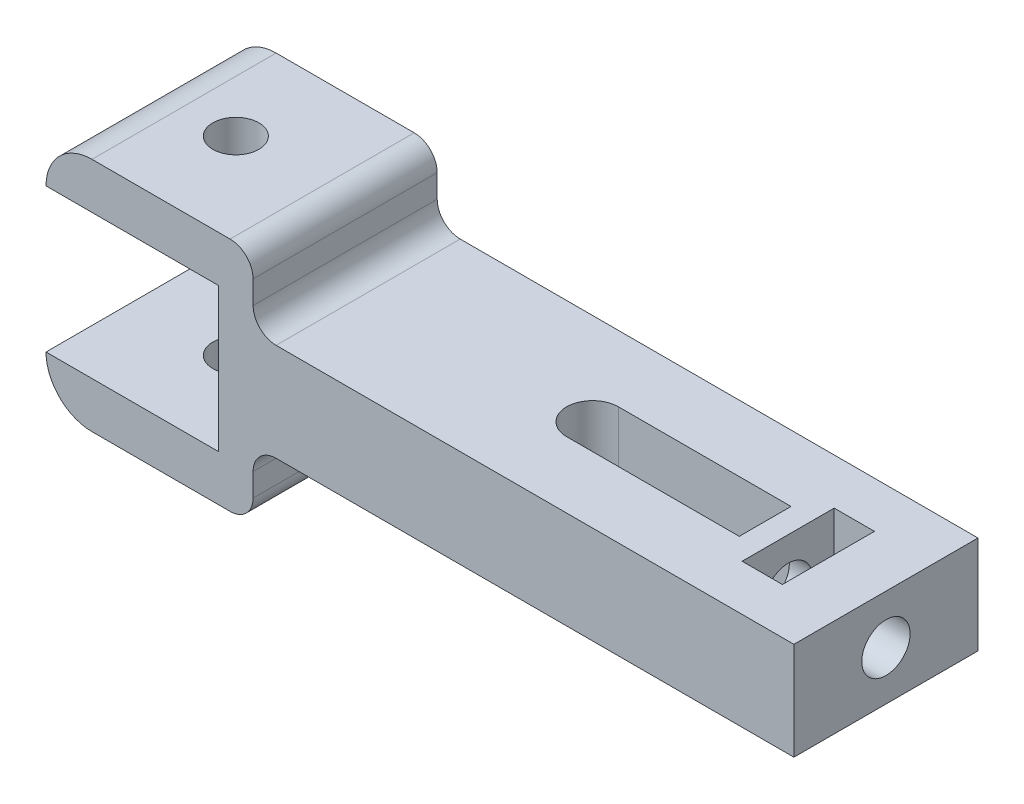
ISO-10303-21;
HEADER;
FILE_DESCRIPTION(('STEP AP214'),'2;1');
FILE_NAME('part.step','',(''),(''),'','','');
FILE_SCHEMA(('AUTOMOTIVE_DESIGN { 1 0 10303 214 1 1 1 1 }'));
ENDSEC;
DATA;
#1=APPLICATION_CONTEXT('core data for automotive mechanical design processes');
#2=APPLICATION_PROTOCOL_DEFINITION('international standard','automotive_design',2000,#1);
#3=PRODUCT_CONTEXT('',#1,'mechanical');
#4=PRODUCT('Part','Part','',(#3));
#5=PRODUCT_RELATED_PRODUCT_CATEGORY('part','',(#4));
#6=PRODUCT_DEFINITION_FORMATION('','',#4);
#7=PRODUCT_DEFINITION_CONTEXT('part definition',#1,'design');
#8=PRODUCT_DEFINITION('design','',#6,#7);
#9=PRODUCT_DEFINITION_SHAPE('','',#8);
#10=(LENGTH_UNIT() NAMED_UNIT(*) SI_UNIT(.MILLI.,.METRE.));
#11=(NAMED_UNIT(*) PLANE_ANGLE_UNIT() SI_UNIT($,.RADIAN.));
#12=(NAMED_UNIT(*) SI_UNIT($,.STERADIAN.) SOLID_ANGLE_UNIT());
#13=UNCERTAINTY_MEASURE_WITH_UNIT(LENGTH_MEASURE(1.E-05),#10,'distance_accuracy_value','');
#14=(GEOMETRIC_REPRESENTATION_CONTEXT(3) GLOBAL_UNCERTAINTY_ASSIGNED_CONTEXT((#13)) GLOBAL_UNIT_ASSIGNED_CONTEXT((#10,
#11,#12)) REPRESENTATION_CONTEXT('',''));
#15=CARTESIAN_POINT('',(0.,0.,0.));
#16=DIRECTION('',(0.,0.,1.));
#17=DIRECTION('',(1.,0.,0.));
#18=AXIS2_PLACEMENT_3D('',#15,#16,#17);
#19=CARTESIAN_POINT('',(-50.,1.99999999999999,16.));
#20=DIRECTION('',(1.,0.,0.));
#21=DIRECTION('',(0.,0.,-1.));
#22=AXIS2_PLACEMENT_3D('',#19,#20,#21);
#23=PLANE('',#22);
#24=DIRECTION('',(0.,-1.,0.));
#25=VECTOR('',#24,1.);
#26=CARTESIAN_POINT('',(-50.,27.4558441227157,13.6568542494924));
#27=LINE('',#26,#25);
#28=CARTESIAN_POINT('',(-50.,-10.5,13.6568542494924));
#29=VERTEX_POINT('',#28);
#30=CARTESIAN_POINT('',(-50.,1.99999999999999,13.6568542494924));
#31=VERTEX_POINT('',#30);
#32=EDGE_CURVE('E211',#29,#31,#27,.F.);
#33=ORIENTED_EDGE('',*,*,#32,.F.);
#34=DIRECTION('',(0.,0.,-1.));
#35=VECTOR('',#34,1.);
#36=CARTESIAN_POINT('',(-50.,-10.5,16.));
#37=LINE('',#36,#35);
#38=CARTESIAN_POINT('',(-50.,-10.5,16.));
#39=VERTEX_POINT('',#38);
#40=EDGE_CURVE('E231',#39,#29,#37,.T.);
#41=ORIENTED_EDGE('',*,*,#40,.F.);
#42=DIRECTION('',(0.,-1.,0.));
#43=VECTOR('',#42,1.);
#44=CARTESIAN_POINT('',(-50.,1.99999999999999,16.));
#45=LINE('',#44,#43);
#46=CARTESIAN_POINT('',(-50.,1.99999999999999,16.));
#47=VERTEX_POINT('',#46);
#48=EDGE_CURVE('E383',#47,#39,#45,.T.);
#49=ORIENTED_EDGE('',*,*,#48,.F.);
#50=DIRECTION('',(0.,0.,-1.));
#51=VECTOR('',#50,1.);
#52=CARTESIAN_POINT('',(-50.,1.99999999999999,16.));
#53=LINE('',#52,#51);
#54=EDGE_CURVE('E230',#47,#31,#53,.T.);
#55=ORIENTED_EDGE('',*,*,#54,.T.);
#56=EDGE_LOOP('',(#33,#41,#49,#55));
#57=FACE_BOUND('',#56,.T.);
#58=ADVANCED_FACE('F33',(#57),#23,.F.);
#59=DIRECTION('',(0.,-1.,0.));
#60=VECTOR('',#59,1.);
#61=CARTESIAN_POINT('',(-50.,27.4558441227157,2.34314575050762));
#62=LINE('',#61,#60);
#63=CARTESIAN_POINT('',(-50.,1.99999999999999,2.34314575050762));
#64=VERTEX_POINT('',#63);
#65=CARTESIAN_POINT('',(-50.,-10.5,2.34314575050762));
#66=VERTEX_POINT('',#65);
#67=EDGE_CURVE('E208',#64,#66,#62,.T.);
#68=ORIENTED_EDGE('',*,*,#67,.F.);
#69=CARTESIAN_POINT('',(-50.,1.99999999999999,0.));
#70=VERTEX_POINT('',#69);
#71=EDGE_CURVE('E223',#64,#70,#53,.T.);
#72=ORIENTED_EDGE('',*,*,#71,.T.);
#73=DIRECTION('',(0.,-1.,0.));
#74=VECTOR('',#73,1.);
#75=CARTESIAN_POINT('',(-50.,1.99999999999999,0.));
#76=LINE('',#75,#74);
#77=CARTESIAN_POINT('',(-50.,-10.5,0.));
#78=VERTEX_POINT('',#77);
#79=EDGE_CURVE('E338',#70,#78,#76,.T.);
#80=ORIENTED_EDGE('',*,*,#79,.T.);
#81=EDGE_CURVE('E225',#66,#78,#37,.T.);
#82=ORIENTED_EDGE('',*,*,#81,.F.);
#83=EDGE_LOOP('',(#68,#72,#80,#82));
#84=FACE_BOUND('',#83,.T.);
#85=ADVANCED_FACE('F221',(#84),#23,.F.);
#86=CARTESIAN_POINT('',(0.,0.,16.));
#87=DIRECTION('',(-1.,0.,0.));
#88=DIRECTION('',(0.,-1.,0.));
#89=AXIS2_PLACEMENT_3D('',#86,#87,#88);
#90=PLANE('',#89);
#91=CARTESIAN_POINT('',(0.,-4.25,8.));
#92=DIRECTION('',(1.,0.,0.));
#93=DIRECTION('',(0.,1.,0.));
#94=AXIS2_PLACEMENT_3D('',#91,#92,#93);
#95=CIRCLE('',#94,2.1);
#96=CARTESIAN_POINT('',(0.,-2.15,8.));
#97=VERTEX_POINT('',#96);
#98=EDGE_CURVE('E444',#97,#97,#95,.T.);
#99=ORIENTED_EDGE('',*,*,#98,.F.);
#100=EDGE_LOOP('',(#99));
#101=FACE_BOUND('',#100,.T.);
#102=DIRECTION('',(0.,1.,0.));
#103=VECTOR('',#102,1.);
#104=CARTESIAN_POINT('',(0.,0.,0.));
#105=LINE('',#104,#103);
#106=CARTESIAN_POINT('',(0.,-8.5,0.));
#107=VERTEX_POINT('',#106);
#108=CARTESIAN_POINT('',(0.,0.,0.));
#109=VERTEX_POINT('',#108);
#110=EDGE_CURVE('E364',#107,#109,#105,.T.);
#111=ORIENTED_EDGE('',*,*,#110,.T.);
#112=DIRECTION('',(0.,0.,-1.));
#113=VECTOR('',#112,1.);
#114=CARTESIAN_POINT('',(0.,0.,16.));
#115=LINE('',#114,#113);
#116=CARTESIAN_POINT('',(0.,0.,16.));
#117=VERTEX_POINT('',#116);
#118=EDGE_CURVE('E239',#117,#109,#115,.T.);
#119=ORIENTED_EDGE('',*,*,#118,.F.);
#120=DIRECTION('',(0.,1.,0.));
#121=VECTOR('',#120,1.);
#122=CARTESIAN_POINT('',(0.,0.,16.));
#123=LINE('',#122,#121);
#124=CARTESIAN_POINT('',(0.,-8.5,16.));
#125=VERTEX_POINT('',#124);
#126=EDGE_CURVE('E349',#125,#117,#123,.T.);
#127=ORIENTED_EDGE('',*,*,#126,.F.);
#128=DIRECTION('',(0.,0.,-1.));
#129=VECTOR('',#128,1.);
#130=CARTESIAN_POINT('',(0.,-8.5,16.));
#131=LINE('',#130,#129);
#132=EDGE_CURVE('E350',#125,#107,#131,.T.);
#133=ORIENTED_EDGE('',*,*,#132,.T.);
#134=EDGE_LOOP('',(#111,#119,#127,#133));
#135=FACE_BOUND('',#134,.T.);
#136=ADVANCED_FACE('F486',(#101,#135),#90,.F.);
#137=CARTESIAN_POINT('',(0.,0.,16.));
#138=DIRECTION('',(0.,-1.,0.));
#139=DIRECTION('',(1.,0.,0.));
#140=AXIS2_PLACEMENT_3D('',#137,#138,#139);
#141=PLANE('',#140);
#142=DIRECTION('',(-1.,0.,0.));
#143=VECTOR('',#142,1.);
#144=CARTESIAN_POINT('',(-25.5,0.,5.75));
#145=LINE('',#144,#143);
#146=CARTESIAN_POINT('',(-10.5,0.,5.75));
#147=VERTEX_POINT('',#146);
#148=CARTESIAN_POINT('',(-25.5,0.,5.75));
#149=VERTEX_POINT('',#148);
#150=EDGE_CURVE('E430',#147,#149,#145,.T.);
#151=ORIENTED_EDGE('',*,*,#150,.F.);
#152=DIRECTION('',(0.,0.,-1.));
#153=VECTOR('',#152,1.);
#154=CARTESIAN_POINT('',(-10.5,0.,10.25));
#155=LINE('',#154,#153);
#156=CARTESIAN_POINT('',(-10.5,0.,10.25));
#157=VERTEX_POINT('',#156);
#158=EDGE_CURVE('E433',#157,#147,#155,.T.);
#159=ORIENTED_EDGE('',*,*,#158,.F.);
#160=DIRECTION('',(1.,0.,0.));
#161=VECTOR('',#160,1.);
#162=CARTESIAN_POINT('',(-25.5,0.,10.25));
#163=LINE('',#162,#161);
#164=CARTESIAN_POINT('',(-25.5,0.,10.25));
#165=VERTEX_POINT('',#164);
#166=EDGE_CURVE('E420',#165,#157,#163,.T.);
#167=ORIENTED_EDGE('',*,*,#166,.F.);
#168=CARTESIAN_POINT('',(-25.5000004026552,0.,8.));
#169=DIRECTION('',(0.,1.,0.));
#170=DIRECTION('',(-1.,0.,0.));
#171=AXIS2_PLACEMENT_3D('',#168,#169,#170);
#172=CIRCLE('',#171,2.25000000000004);
#173=EDGE_CURVE('E427',#149,#165,#172,.T.);
#174=ORIENTED_EDGE('',*,*,#173,.F.);
#175=EDGE_LOOP('',(#151,#159,#167,#174));
#176=FACE_BOUND('',#175,.T.);
#177=DIRECTION('',(-1.,0.,0.));
#178=VECTOR('',#177,1.);
#179=CARTESIAN_POINT('',(-8.5,0.,4.));
#180=LINE('',#179,#178);
#181=CARTESIAN_POINT('',(-5.,0.,4.));
#182=VERTEX_POINT('',#181);
#183=CARTESIAN_POINT('',(-8.5,0.,4.));
#184=VERTEX_POINT('',#183);
#185=EDGE_CURVE('E410',#182,#184,#180,.T.);
#186=ORIENTED_EDGE('',*,*,#185,.F.);
#187=DIRECTION('',(0.,0.,-1.));
#188=VECTOR('',#187,1.);
#189=CARTESIAN_POINT('',(-5.,0.,4.));
#190=LINE('',#189,#188);
#191=CARTESIAN_POINT('',(-5.,0.,12.));
#192=VERTEX_POINT('',#191);
#193=EDGE_CURVE('E413',#192,#182,#190,.T.);
#194=ORIENTED_EDGE('',*,*,#193,.F.);
#195=DIRECTION('',(1.,0.,0.));
#196=VECTOR('',#195,1.);
#197=CARTESIAN_POINT('',(-8.5,0.,12.));
#198=LINE('',#197,#196);
#199=CARTESIAN_POINT('',(-8.5,0.,12.));
#200=VERTEX_POINT('',#199);
#201=EDGE_CURVE('E400',#200,#192,#198,.T.);
#202=ORIENTED_EDGE('',*,*,#201,.F.);
#203=DIRECTION('',(0.,0.,1.));
#204=VECTOR('',#203,1.);
#205=CARTESIAN_POINT('',(-8.5,0.,4.));
#206=LINE('',#205,#204);
#207=EDGE_CURVE('E407',#184,#200,#206,.T.);
#208=ORIENTED_EDGE('',*,*,#207,.F.);
#209=EDGE_LOOP('',(#186,#194,#202,#208));
#210=FACE_BOUND('',#209,.T.);
#211=DIRECTION('',(-1.,0.,0.));
#212=VECTOR('',#211,1.);
#213=CARTESIAN_POINT('',(0.,0.,0.));
#214=LINE('',#213,#212);
#215=CARTESIAN_POINT('',(-45.,0.,0.));
#216=VERTEX_POINT('',#215);
#217=EDGE_CURVE('E366',#109,#216,#214,.T.);
#218=ORIENTED_EDGE('',*,*,#217,.T.);
#219=DIRECTION('',(0.,0.,-1.));
#220=VECTOR('',#219,1.);
#221=CARTESIAN_POINT('',(-45.,0.,16.));
#222=LINE('',#221,#220);
#223=CARTESIAN_POINT('',(-45.,0.,16.));
#224=VERTEX_POINT('',#223);
#225=EDGE_CURVE('E291',#216,#224,#222,.F.);
#226=ORIENTED_EDGE('',*,*,#225,.T.);
#227=DIRECTION('',(-1.,0.,0.));
#228=VECTOR('',#227,1.);
#229=CARTESIAN_POINT('',(0.,0.,16.));
#230=LINE('',#229,#228);
#231=EDGE_CURVE('E392',#117,#224,#230,.T.);
#232=ORIENTED_EDGE('',*,*,#231,.F.);
#233=ORIENTED_EDGE('',*,*,#118,.T.);
#234=EDGE_LOOP('',(#218,#226,#232,#233));
#235=FACE_BOUND('',#234,.T.);
#236=ADVANCED_FACE('F494',(#176,#210,#235),#141,.F.);
#237=CARTESIAN_POINT('',(-47.,0.,16.));
#238=DIRECTION('',(-1.,0.,0.));
#239=DIRECTION('',(0.,0.,1.));
#240=AXIS2_PLACEMENT_3D('',#237,#238,#239);
#241=PLANE('',#240);
#242=DIRECTION('',(0.,1.,0.));
#243=VECTOR('',#242,1.);
#244=CARTESIAN_POINT('',(-47.,0.,0.));
#245=LINE('',#244,#243);
#246=CARTESIAN_POINT('',(-47.,1.99999999999999,0.));
#247=VERTEX_POINT('',#246);
#248=CARTESIAN_POINT('',(-47.,3.99999999999999,0.));
#249=VERTEX_POINT('',#248);
#250=EDGE_CURVE('E370',#247,#249,#245,.T.);
#251=ORIENTED_EDGE('',*,*,#250,.T.);
#252=DIRECTION('',(0.,0.,-1.));
#253=VECTOR('',#252,1.);
#254=CARTESIAN_POINT('',(-47.,3.99999999999999,16.));
#255=LINE('',#254,#253);
#256=CARTESIAN_POINT('',(-47.,3.99999999999999,16.));
#257=VERTEX_POINT('',#256);
#258=EDGE_CURVE('E285',#249,#257,#255,.F.);
#259=ORIENTED_EDGE('',*,*,#258,.T.);
#260=DIRECTION('',(0.,1.,0.));
#261=VECTOR('',#260,1.);
#262=CARTESIAN_POINT('',(-47.,0.,16.));
#263=LINE('',#262,#261);
#264=CARTESIAN_POINT('',(-47.,1.99999999999999,16.));
#265=VERTEX_POINT('',#264);
#266=EDGE_CURVE('E386',#265,#257,#263,.T.);
#267=ORIENTED_EDGE('',*,*,#266,.F.);
#268=DIRECTION('',(0.,0.,-1.));
#269=VECTOR('',#268,1.);
#270=CARTESIAN_POINT('',(-47.,1.99999999999999,0.));
#271=LINE('',#270,#269);
#272=EDGE_CURVE('E282',#265,#247,#271,.T.);
#273=ORIENTED_EDGE('',*,*,#272,.T.);
#274=EDGE_LOOP('',(#251,#259,#267,#273));
#275=FACE_BOUND('',#274,.T.);
#276=ADVANCED_FACE('F490',(#275),#241,.F.);
#277=CARTESIAN_POINT('',(-47.,5.99999999999999,16.));
#278=DIRECTION('',(0.,-1.,0.));
#279=DIRECTION('',(1.,0.,0.));
#280=AXIS2_PLACEMENT_3D('',#277,#278,#279);
#281=PLANE('',#280);
#282=CARTESIAN_POINT('',(-56.5,5.99999999999999,8.));
#283=DIRECTION('',(0.,1.,0.));
#284=DIRECTION('',(-1.,0.,0.));
#285=AXIS2_PLACEMENT_3D('',#282,#283,#284);
#286=CIRCLE('',#285,2.);
#287=CARTESIAN_POINT('',(-58.5,5.99999999999999,8.));
#288=VERTEX_POINT('',#287);
#289=EDGE_CURVE('E456',#288,#288,#286,.T.);
#290=ORIENTED_EDGE('',*,*,#289,.F.);
#291=EDGE_LOOP('',(#290));
#292=FACE_BOUND('',#291,.T.);
#293=DIRECTION('',(-1.,0.,0.));
#294=VECTOR('',#293,1.);
#295=CARTESIAN_POINT('',(-47.,5.99999999999999,0.));
#296=LINE('',#295,#294);
#297=CARTESIAN_POINT('',(-49.,5.99999999999999,0.));
#298=VERTEX_POINT('',#297);
#299=CARTESIAN_POINT('',(-61.,5.99999999999999,0.));
#300=VERTEX_POINT('',#299);
#301=EDGE_CURVE('E373',#298,#300,#296,.T.);
#302=ORIENTED_EDGE('',*,*,#301,.T.);
#303=DIRECTION('',(0.,0.,-1.));
#304=VECTOR('',#303,1.);
#305=CARTESIAN_POINT('',(-61.,5.99999999999999,16.));
#306=LINE('',#305,#304);
#307=CARTESIAN_POINT('',(-61.,5.99999999999999,16.));
#308=VERTEX_POINT('',#307);
#309=EDGE_CURVE('E11',#300,#308,#306,.F.);
#310=ORIENTED_EDGE('',*,*,#309,.T.);
#311=DIRECTION('',(-1.,0.,0.));
#312=VECTOR('',#311,1.);
#313=CARTESIAN_POINT('',(-47.,5.99999999999999,16.));
#314=LINE('',#313,#312);
#315=CARTESIAN_POINT('',(-49.,5.99999999999999,16.));
#316=VERTEX_POINT('',#315);
#317=EDGE_CURVE('E381',#316,#308,#314,.T.);
#318=ORIENTED_EDGE('',*,*,#317,.F.);
#319=DIRECTION('',(0.,0.,-1.));
#320=VECTOR('',#319,1.);
#321=CARTESIAN_POINT('',(-49.,5.99999999999999,16.));
#322=LINE('',#321,#320);
#323=EDGE_CURVE('E274',#316,#298,#322,.T.);
#324=ORIENTED_EDGE('',*,*,#323,.T.);
#325=EDGE_LOOP('',(#302,#310,#318,#324));
#326=FACE_BOUND('',#325,.T.);
#327=ADVANCED_FACE('F374',(#292,#326),#281,.F.);
#328=CARTESIAN_POINT('',(-65.,1.99999999999999,16.));
#329=DIRECTION('',(0.,1.,0.));
#330=DIRECTION('',(-1.,0.,0.));
#331=AXIS2_PLACEMENT_3D('',#328,#329,#330);
#332=PLANE('',#331);
#333=CARTESIAN_POINT('',(-56.5,1.99999999999999,8.));
#334=DIRECTION('',(0.,1.,0.));
#335=DIRECTION('',(-1.,0.,0.));
#336=AXIS2_PLACEMENT_3D('',#333,#334,#335);
#337=CIRCLE('',#336,2.);
#338=CARTESIAN_POINT('',(-58.5,1.99999999999999,8.));
#339=VERTEX_POINT('',#338);
#340=EDGE_CURVE('E449',#339,#339,#337,.T.);
#341=ORIENTED_EDGE('',*,*,#340,.T.);
#342=EDGE_LOOP('',(#341));
#343=FACE_BOUND('',#342,.T.);
#344=DIRECTION('',(0.,0.,-1.));
#345=VECTOR('',#344,1.);
#346=CARTESIAN_POINT('',(-65.,1.99999999999999,16.));
#347=LINE('',#346,#345);
#348=CARTESIAN_POINT('',(-65.,1.99999999999999,16.));
#349=VERTEX_POINT('',#348);
#350=CARTESIAN_POINT('',(-65.,1.99999999999999,0.));
#351=VERTEX_POINT('',#350);
#352=EDGE_CURVE('E233',#349,#351,#347,.T.);
#353=ORIENTED_EDGE('',*,*,#352,.T.);
#354=DIRECTION('',(1.,0.,0.));
#355=VECTOR('',#354,1.);
#356=CARTESIAN_POINT('',(-65.,1.99999999999999,0.));
#357=LINE('',#356,#355);
#358=EDGE_CURVE('E229',#351,#70,#357,.T.);
#359=ORIENTED_EDGE('',*,*,#358,.T.);
#360=ORIENTED_EDGE('',*,*,#71,.F.);
#361=CARTESIAN_POINT('',(-57.,1.99999999999999,8.));
#362=DIRECTION('',(0.,1.,0.));
#363=DIRECTION('',(-1.,0.,0.));
#364=AXIS2_PLACEMENT_3D('',#361,#362,#363);
#365=CIRCLE('',#364,9.);
#366=EDGE_CURVE('E205',#31,#64,#365,.T.);
#367=ORIENTED_EDGE('',*,*,#366,.F.);
#368=ORIENTED_EDGE('',*,*,#54,.F.);
#369=DIRECTION('',(1.,0.,0.));
#370=VECTOR('',#369,1.);
#371=CARTESIAN_POINT('',(-65.,1.99999999999999,16.));
#372=LINE('',#371,#370);
#373=EDGE_CURVE('E380',#349,#47,#372,.T.);
#374=ORIENTED_EDGE('',*,*,#373,.F.);
#375=EDGE_LOOP('',(#353,#359,#360,#367,#368,#374));
#376=FACE_BOUND('',#375,.T.);
#377=ADVANCED_FACE('F228',(#343,#376),#332,.F.);
#378=CARTESIAN_POINT('',(-65.,-10.5,16.));
#379=DIRECTION('',(0.,-1.,0.));
#380=DIRECTION('',(1.,0.,0.));
#381=AXIS2_PLACEMENT_3D('',#378,#379,#380);
#382=PLANE('',#381);
#383=CARTESIAN_POINT('',(-56.5,-10.5,8.));
#384=DIRECTION('',(0.,-1.,0.));
#385=DIRECTION('',(1.,0.,0.));
#386=AXIS2_PLACEMENT_3D('',#383,#384,#385);
#387=CIRCLE('',#386,2.);
#388=CARTESIAN_POINT('',(-54.5,-10.5,8.));
#389=VERTEX_POINT('',#388);
#390=EDGE_CURVE('E452',#389,#389,#387,.T.);
#391=ORIENTED_EDGE('',*,*,#390,.T.);
#392=EDGE_LOOP('',(#391));
#393=FACE_BOUND('',#392,.T.);
#394=ORIENTED_EDGE('',*,*,#40,.T.);
#395=CARTESIAN_POINT('',(-57.,-10.5,8.));
#396=DIRECTION('',(0.,1.,0.));
#397=DIRECTION('',(-1.,0.,0.));
#398=AXIS2_PLACEMENT_3D('',#395,#396,#397);
#399=CIRCLE('',#398,9.);
#400=EDGE_CURVE('E216',#29,#66,#399,.T.);
#401=ORIENTED_EDGE('',*,*,#400,.T.);
#402=ORIENTED_EDGE('',*,*,#81,.T.);
#403=DIRECTION('',(-1.,0.,0.));
#404=VECTOR('',#403,1.);
#405=CARTESIAN_POINT('',(-65.,-10.5,0.));
#406=LINE('',#405,#404);
#407=CARTESIAN_POINT('',(-65.,-10.5,0.));
#408=VERTEX_POINT('',#407);
#409=EDGE_CURVE('E334',#78,#408,#406,.T.);
#410=ORIENTED_EDGE('',*,*,#409,.T.);
#411=DIRECTION('',(0.,0.,-1.));
#412=VECTOR('',#411,1.);
#413=CARTESIAN_POINT('',(-65.,-10.5,16.));
#414=LINE('',#413,#412);
#415=CARTESIAN_POINT('',(-65.,-10.5,16.));
#416=VERTEX_POINT('',#415);
#417=EDGE_CURVE('E330',#416,#408,#414,.T.);
#418=ORIENTED_EDGE('',*,*,#417,.F.);
#419=DIRECTION('',(-1.,0.,0.));
#420=VECTOR('',#419,1.);
#421=CARTESIAN_POINT('',(-65.,-10.5,16.));
#422=LINE('',#421,#420);
#423=EDGE_CURVE('E317',#39,#416,#422,.T.);
#424=ORIENTED_EDGE('',*,*,#423,.F.);
#425=EDGE_LOOP('',(#394,#401,#402,#410,#418,#424));
#426=FACE_BOUND('',#425,.T.);
#427=ADVANCED_FACE('F337',(#393,#426),#382,.F.);
#428=CARTESIAN_POINT('',(-47.,-14.5,16.));
#429=DIRECTION('',(0.,1.,0.));
#430=DIRECTION('',(-1.,0.,0.));
#431=AXIS2_PLACEMENT_3D('',#428,#429,#430);
#432=PLANE('',#431);
#433=CARTESIAN_POINT('',(-56.5,-14.5,8.));
#434=DIRECTION('',(0.,1.,0.));
#435=DIRECTION('',(-1.,0.,0.));
#436=AXIS2_PLACEMENT_3D('',#433,#434,#435);
#437=CIRCLE('',#436,2.);
#438=CARTESIAN_POINT('',(-58.5,-14.5,8.));
#439=VERTEX_POINT('',#438);
#440=EDGE_CURVE('E455',#439,#439,#437,.T.);
#441=ORIENTED_EDGE('',*,*,#440,.T.);
#442=EDGE_LOOP('',(#441));
#443=FACE_BOUND('',#442,.T.);
#444=DIRECTION('',(1.,0.,0.));
#445=VECTOR('',#444,1.);
#446=CARTESIAN_POINT('',(-47.,-14.5,16.));
#447=LINE('',#446,#445);
#448=CARTESIAN_POINT('',(-61.,-14.5,16.));
#449=VERTEX_POINT('',#448);
#450=CARTESIAN_POINT('',(-49.,-14.5,16.));
#451=VERTEX_POINT('',#450);
#452=EDGE_CURVE('E315',#449,#451,#447,.T.);
#453=ORIENTED_EDGE('',*,*,#452,.F.);
#454=DIRECTION('',(0.,0.,-1.));
#455=VECTOR('',#454,1.);
#456=CARTESIAN_POINT('',(-61.,-14.5,16.));
#457=LINE('',#456,#455);
#458=CARTESIAN_POINT('',(-61.,-14.5,0.));
#459=VERTEX_POINT('',#458);
#460=EDGE_CURVE('E304',#449,#459,#457,.T.);
#461=ORIENTED_EDGE('',*,*,#460,.T.);
#462=DIRECTION('',(1.,0.,0.));
#463=VECTOR('',#462,1.);
#464=CARTESIAN_POINT('',(-47.,-14.5,0.));
#465=LINE('',#464,#463);
#466=CARTESIAN_POINT('',(-49.,-14.5,0.));
#467=VERTEX_POINT('',#466);
#468=EDGE_CURVE('E335',#459,#467,#465,.T.);
#469=ORIENTED_EDGE('',*,*,#468,.T.);
#470=DIRECTION('',(0.,0.,-1.));
#471=VECTOR('',#470,1.);
#472=CARTESIAN_POINT('',(-49.,-14.5,16.));
#473=LINE('',#472,#471);
#474=EDGE_CURVE('E293',#467,#451,#473,.F.);
#475=ORIENTED_EDGE('',*,*,#474,.T.);
#476=EDGE_LOOP('',(#453,#461,#469,#475));
#477=FACE_BOUND('',#476,.T.);
#478=ADVANCED_FACE('F323',(#443,#477),#432,.F.);
#479=CARTESIAN_POINT('',(-47.,-8.50000000000001,16.));
#480=DIRECTION('',(-1.,0.,0.));
#481=DIRECTION('',(0.,0.,1.));
#482=AXIS2_PLACEMENT_3D('',#479,#480,#481);
#483=PLANE('',#482);
#484=DIRECTION('',(0.,1.,0.));
#485=VECTOR('',#484,1.);
#486=CARTESIAN_POINT('',(-47.,-8.50000000000001,0.));
#487=LINE('',#486,#485);
#488=CARTESIAN_POINT('',(-47.,-12.5,0.));
#489=VERTEX_POINT('',#488);
#490=CARTESIAN_POINT('',(-47.,-10.5,0.));
#491=VERTEX_POINT('',#490);
#492=EDGE_CURVE('E340',#489,#491,#487,.T.);
#493=ORIENTED_EDGE('',*,*,#492,.T.);
#494=DIRECTION('',(0.,0.,-1.));
#495=VECTOR('',#494,1.);
#496=CARTESIAN_POINT('',(-47.,-10.5,16.));
#497=LINE('',#496,#495);
#498=CARTESIAN_POINT('',(-47.,-10.5,16.));
#499=VERTEX_POINT('',#498);
#500=EDGE_CURVE('E272',#491,#499,#497,.F.);
#501=ORIENTED_EDGE('',*,*,#500,.T.);
#502=DIRECTION('',(0.,1.,0.));
#503=VECTOR('',#502,1.);
#504=CARTESIAN_POINT('',(-47.,-8.50000000000001,16.));
#505=LINE('',#504,#503);
#506=CARTESIAN_POINT('',(-47.,-12.5,16.));
#507=VERTEX_POINT('',#506);
#508=EDGE_CURVE('E327',#507,#499,#505,.T.);
#509=ORIENTED_EDGE('',*,*,#508,.F.);
#510=DIRECTION('',(0.,0.,-1.));
#511=VECTOR('',#510,1.);
#512=CARTESIAN_POINT('',(-47.,-12.5,16.));
#513=LINE('',#512,#511);
#514=EDGE_CURVE('E269',#507,#489,#513,.T.);
#515=ORIENTED_EDGE('',*,*,#514,.T.);
#516=EDGE_LOOP('',(#493,#501,#509,#515));
#517=FACE_BOUND('',#516,.T.);
#518=ADVANCED_FACE('F476',(#517),#483,.F.);
#519=CARTESIAN_POINT('',(0.,-8.5,16.));
#520=DIRECTION('',(0.,1.,0.));
#521=DIRECTION('',(-1.,0.,0.));
#522=AXIS2_PLACEMENT_3D('',#519,#520,#521);
#523=PLANE('',#522);
#524=DIRECTION('',(1.,0.,0.));
#525=VECTOR('',#524,1.);
#526=CARTESIAN_POINT('',(0.,-8.5,10.25));
#527=LINE('',#526,#525);
#528=CARTESIAN_POINT('',(-25.5,-8.5,10.25));
#529=VERTEX_POINT('',#528);
#530=CARTESIAN_POINT('',(-10.5,-8.5,10.25));
#531=VERTEX_POINT('',#530);
#532=EDGE_CURVE('E260',#529,#531,#527,.T.);
#533=ORIENTED_EDGE('',*,*,#532,.T.);
#534=DIRECTION('',(0.,0.,-1.));
#535=VECTOR('',#534,1.);
#536=CARTESIAN_POINT('',(-10.5,-8.5,16.));
#537=LINE('',#536,#535);
#538=CARTESIAN_POINT('',(-10.5,-8.5,5.75));
#539=VERTEX_POINT('',#538);
#540=EDGE_CURVE('E263',#531,#539,#537,.T.);
#541=ORIENTED_EDGE('',*,*,#540,.T.);
#542=DIRECTION('',(-1.,0.,0.));
#543=VECTOR('',#542,1.);
#544=CARTESIAN_POINT('',(0.,-8.5,5.75));
#545=LINE('',#544,#543);
#546=CARTESIAN_POINT('',(-25.5,-8.5,5.75));
#547=VERTEX_POINT('',#546);
#548=EDGE_CURVE('E254',#539,#547,#545,.T.);
#549=ORIENTED_EDGE('',*,*,#548,.T.);
#550=CARTESIAN_POINT('',(-25.5000004026552,-8.5,8.));
#551=DIRECTION('',(0.,1.,0.));
#552=DIRECTION('',(-1.,0.,0.));
#553=AXIS2_PLACEMENT_3D('',#550,#551,#552);
#554=CIRCLE('',#553,2.25000000000004);
#555=EDGE_CURVE('E257',#547,#529,#554,.T.);
#556=ORIENTED_EDGE('',*,*,#555,.T.);
#557=EDGE_LOOP('',(#533,#541,#549,#556));
#558=FACE_BOUND('',#557,.T.);
#559=DIRECTION('',(1.,0.,0.));
#560=VECTOR('',#559,1.);
#561=CARTESIAN_POINT('',(0.,-8.5,12.));
#562=LINE('',#561,#560);
#563=CARTESIAN_POINT('',(-8.5,-8.5,12.));
#564=VERTEX_POINT('',#563);
#565=CARTESIAN_POINT('',(-5.,-8.5,12.));
#566=VERTEX_POINT('',#565);
#567=EDGE_CURVE('E248',#564,#566,#562,.T.);
#568=ORIENTED_EDGE('',*,*,#567,.T.);
#569=DIRECTION('',(0.,0.,-1.));
#570=VECTOR('',#569,1.);
#571=CARTESIAN_POINT('',(-5.,-8.5,16.));
#572=LINE('',#571,#570);
#573=CARTESIAN_POINT('',(-5.,-8.5,4.));
#574=VERTEX_POINT('',#573);
#575=EDGE_CURVE('E251',#566,#574,#572,.T.);
#576=ORIENTED_EDGE('',*,*,#575,.T.);
#577=DIRECTION('',(-1.,0.,0.));
#578=VECTOR('',#577,1.);
#579=CARTESIAN_POINT('',(0.,-8.5,4.));
#580=LINE('',#579,#578);
#581=CARTESIAN_POINT('',(-8.5,-8.5,4.));
#582=VERTEX_POINT('',#581);
#583=EDGE_CURVE('E242',#574,#582,#580,.T.);
#584=ORIENTED_EDGE('',*,*,#583,.T.);
#585=DIRECTION('',(0.,0.,1.));
#586=VECTOR('',#585,1.);
#587=CARTESIAN_POINT('',(-8.5,-8.5,16.));
#588=LINE('',#587,#586);
#589=EDGE_CURVE('E245',#582,#564,#588,.T.);
#590=ORIENTED_EDGE('',*,*,#589,.T.);
#591=EDGE_LOOP('',(#568,#576,#584,#590));
#592=FACE_BOUND('',#591,.T.);
#593=DIRECTION('',(1.,0.,0.));
#594=VECTOR('',#593,1.);
#595=CARTESIAN_POINT('',(0.,-8.5,16.));
#596=LINE('',#595,#594);
#597=CARTESIAN_POINT('',(-45.,-8.50000000000001,16.));
#598=VERTEX_POINT('',#597);
#599=EDGE_CURVE('E352',#598,#125,#596,.T.);
#600=ORIENTED_EDGE('',*,*,#599,.F.);
#601=DIRECTION('',(0.,0.,-1.));
#602=VECTOR('',#601,1.);
#603=CARTESIAN_POINT('',(-45.,-8.50000000000001,0.));
#604=LINE('',#603,#602);
#605=CARTESIAN_POINT('',(-45.,-8.50000000000001,0.));
#606=VERTEX_POINT('',#605);
#607=EDGE_CURVE('E266',#598,#606,#604,.T.);
#608=ORIENTED_EDGE('',*,*,#607,.T.);
#609=DIRECTION('',(1.,0.,0.));
#610=VECTOR('',#609,1.);
#611=CARTESIAN_POINT('',(0.,-8.5,0.));
#612=LINE('',#611,#610);
#613=EDGE_CURVE('E347',#606,#107,#612,.T.);
#614=ORIENTED_EDGE('',*,*,#613,.T.);
#615=ORIENTED_EDGE('',*,*,#132,.F.);
#616=EDGE_LOOP('',(#600,#608,#614,#615));
#617=FACE_BOUND('',#616,.T.);
#618=ADVANCED_FACE('F568',(#558,#592,#617),#523,.F.);
#619=CARTESIAN_POINT('',(0.,0.,16.));
#620=DIRECTION('',(0.,0.,-1.));
#621=DIRECTION('',(-1.,0.,0.));
#622=AXIS2_PLACEMENT_3D('',#619,#620,#621);
#623=PLANE('',#622);
#624=ORIENTED_EDGE('',*,*,#423,.T.);
#625=CARTESIAN_POINT('',(-61.,-10.5,16.));
#626=DIRECTION('',(0.,0.,-1.));
#627=DIRECTION('',(-1.,0.,0.));
#628=AXIS2_PLACEMENT_3D('',#625,#626,#627);
#629=CIRCLE('',#628,4.);
#630=EDGE_CURVE('E41',#416,#449,#629,.F.);
#631=ORIENTED_EDGE('',*,*,#630,.T.);
#632=ORIENTED_EDGE('',*,*,#452,.T.);
#633=CARTESIAN_POINT('',(-49.,-12.5,16.));
#634=DIRECTION('',(0.,0.,-1.));
#635=DIRECTION('',(-1.,0.,0.));
#636=AXIS2_PLACEMENT_3D('',#633,#634,#635);
#637=CIRCLE('',#636,2.);
#638=EDGE_CURVE('E287',#451,#507,#637,.F.);
#639=ORIENTED_EDGE('',*,*,#638,.T.);
#640=ORIENTED_EDGE('',*,*,#508,.T.);
#641=CARTESIAN_POINT('',(-45.,-10.5,16.));
#642=DIRECTION('',(0.,0.,-1.));
#643=DIRECTION('',(-1.,0.,0.));
#644=AXIS2_PLACEMENT_3D('',#641,#642,#643);
#645=CIRCLE('',#644,2.);
#646=EDGE_CURVE('E298',#499,#598,#645,.T.);
#647=ORIENTED_EDGE('',*,*,#646,.T.);
#648=ORIENTED_EDGE('',*,*,#599,.T.);
#649=ORIENTED_EDGE('',*,*,#126,.T.);
#650=ORIENTED_EDGE('',*,*,#231,.T.);
#651=CARTESIAN_POINT('',(-45.,1.99999999999999,16.));
#652=DIRECTION('',(0.,0.,-1.));
#653=DIRECTION('',(-1.,0.,0.));
#654=AXIS2_PLACEMENT_3D('',#651,#652,#653);
#655=CIRCLE('',#654,2.);
#656=EDGE_CURVE('E302',#224,#265,#655,.T.);
#657=ORIENTED_EDGE('',*,*,#656,.T.);
#658=ORIENTED_EDGE('',*,*,#266,.T.);
#659=CARTESIAN_POINT('',(-49.,3.99999999999999,16.));
#660=DIRECTION('',(0.,0.,-1.));
#661=DIRECTION('',(-1.,0.,0.));
#662=AXIS2_PLACEMENT_3D('',#659,#660,#661);
#663=CIRCLE('',#662,2.);
#664=EDGE_CURVE('E289',#257,#316,#663,.F.);
#665=ORIENTED_EDGE('',*,*,#664,.T.);
#666=ORIENTED_EDGE('',*,*,#317,.T.);
#667=CARTESIAN_POINT('',(-61.,1.99999999999999,16.));
#668=DIRECTION('',(0.,0.,-1.));
#669=DIRECTION('',(-1.,0.,0.));
#670=AXIS2_PLACEMENT_3D('',#667,#668,#669);
#671=CIRCLE('',#670,4.);
#672=EDGE_CURVE('E310',#308,#349,#671,.F.);
#673=ORIENTED_EDGE('',*,*,#672,.T.);
#674=ORIENTED_EDGE('',*,*,#373,.T.);
#675=ORIENTED_EDGE('',*,*,#48,.T.);
#676=EDGE_LOOP('',(#624,#631,#632,#639,#640,#647,#648,#649,#650,#657,#658,#665,#666,#673,#674,#675));
#677=FACE_BOUND('',#676,.T.);
#678=ADVANCED_FACE('F314',(#677),#623,.F.);
#679=CARTESIAN_POINT('',(0.,0.,0.));
#680=DIRECTION('',(0.,0.,-1.));
#681=DIRECTION('',(-1.,0.,0.));
#682=AXIS2_PLACEMENT_3D('',#679,#680,#681);
#683=PLANE('',#682);
#684=ORIENTED_EDGE('',*,*,#468,.F.);
#685=CARTESIAN_POINT('',(-61.,-10.5,0.));
#686=DIRECTION('',(0.,0.,-1.));
#687=DIRECTION('',(-1.,0.,0.));
#688=AXIS2_PLACEMENT_3D('',#685,#686,#687);
#689=CIRCLE('',#688,4.);
#690=EDGE_CURVE('E308',#459,#408,#689,.T.);
#691=ORIENTED_EDGE('',*,*,#690,.T.);
#692=ORIENTED_EDGE('',*,*,#409,.F.);
#693=ORIENTED_EDGE('',*,*,#79,.F.);
#694=ORIENTED_EDGE('',*,*,#358,.F.);
#695=CARTESIAN_POINT('',(-61.,1.99999999999999,0.));
#696=DIRECTION('',(0.,0.,-1.));
#697=DIRECTION('',(-1.,0.,0.));
#698=AXIS2_PLACEMENT_3D('',#695,#696,#697);
#699=CIRCLE('',#698,4.);
#700=EDGE_CURVE('E54',#351,#300,#699,.T.);
#701=ORIENTED_EDGE('',*,*,#700,.T.);
#702=ORIENTED_EDGE('',*,*,#301,.F.);
#703=CARTESIAN_POINT('',(-49.,3.99999999999999,0.));
#704=DIRECTION('',(0.,0.,-1.));
#705=DIRECTION('',(-1.,0.,0.));
#706=AXIS2_PLACEMENT_3D('',#703,#704,#705);
#707=CIRCLE('',#706,2.);
#708=EDGE_CURVE('E280',#298,#249,#707,.T.);
#709=ORIENTED_EDGE('',*,*,#708,.T.);
#710=ORIENTED_EDGE('',*,*,#250,.F.);
#711=CARTESIAN_POINT('',(-45.,1.99999999999999,0.));
#712=DIRECTION('',(0.,0.,-1.));
#713=DIRECTION('',(-1.,0.,0.));
#714=AXIS2_PLACEMENT_3D('',#711,#712,#713);
#715=CIRCLE('',#714,2.);
#716=EDGE_CURVE('E300',#247,#216,#715,.F.);
#717=ORIENTED_EDGE('',*,*,#716,.T.);
#718=ORIENTED_EDGE('',*,*,#217,.F.);
#719=ORIENTED_EDGE('',*,*,#110,.F.);
#720=ORIENTED_EDGE('',*,*,#613,.F.);
#721=CARTESIAN_POINT('',(-45.,-10.5,0.));
#722=DIRECTION('',(0.,0.,-1.));
#723=DIRECTION('',(-1.,0.,0.));
#724=AXIS2_PLACEMENT_3D('',#721,#722,#723);
#725=CIRCLE('',#724,2.);
#726=EDGE_CURVE('E296',#606,#491,#725,.F.);
#727=ORIENTED_EDGE('',*,*,#726,.T.);
#728=ORIENTED_EDGE('',*,*,#492,.F.);
#729=CARTESIAN_POINT('',(-49.,-12.5,0.));
#730=DIRECTION('',(0.,0.,-1.));
#731=DIRECTION('',(-1.,0.,0.));
#732=AXIS2_PLACEMENT_3D('',#729,#730,#731);
#733=CIRCLE('',#732,2.);
#734=EDGE_CURVE('E277',#489,#467,#733,.T.);
#735=ORIENTED_EDGE('',*,*,#734,.T.);
#736=EDGE_LOOP('',(#684,#691,#692,#693,#694,#701,#702,#709,#710,#717,#718,#719,#720,#727,#728,#735));
#737=FACE_BOUND('',#736,.T.);
#738=ADVANCED_FACE('F333',(#737),#683,.T.);
#739=CARTESIAN_POINT('',(-5.,-14.5,4.));
#740=DIRECTION('',(1.,0.,0.));
#741=DIRECTION('',(0.,1.,0.));
#742=AXIS2_PLACEMENT_3D('',#739,#740,#741);
#743=PLANE('',#742);
#744=CARTESIAN_POINT('',(-5.,-4.25,8.));
#745=DIRECTION('',(1.,0.,0.));
#746=DIRECTION('',(0.,1.,0.));
#747=AXIS2_PLACEMENT_3D('',#744,#745,#746);
#748=CIRCLE('',#747,2.1);
#749=CARTESIAN_POINT('',(-5.,-2.15,8.));
#750=VERTEX_POINT('',#749);
#751=EDGE_CURVE('E435',#750,#750,#748,.T.);
#752=ORIENTED_EDGE('',*,*,#751,.T.);
#753=EDGE_LOOP('',(#752));
#754=FACE_BOUND('',#753,.T.);
#755=DIRECTION('',(0.,1.,0.));
#756=VECTOR('',#755,1.);
#757=CARTESIAN_POINT('',(-5.,-14.5,12.));
#758=LINE('',#757,#756);
#759=EDGE_CURVE('E367',#566,#192,#758,.T.);
#760=ORIENTED_EDGE('',*,*,#759,.T.);
#761=ORIENTED_EDGE('',*,*,#193,.T.);
#762=DIRECTION('',(0.,1.,0.));
#763=VECTOR('',#762,1.);
#764=CARTESIAN_POINT('',(-5.,-14.5,4.));
#765=LINE('',#764,#763);
#766=EDGE_CURVE('E396',#574,#182,#765,.T.);
#767=ORIENTED_EDGE('',*,*,#766,.F.);
#768=ORIENTED_EDGE('',*,*,#575,.F.);
#769=EDGE_LOOP('',(#760,#761,#767,#768));
#770=FACE_BOUND('',#769,.T.);
#771=ADVANCED_FACE('F555',(#754,#770),#743,.F.);
#772=CARTESIAN_POINT('',(-8.5,-14.5,12.));
#773=DIRECTION('',(0.,0.,1.));
#774=DIRECTION('',(1.,0.,0.));
#775=AXIS2_PLACEMENT_3D('',#772,#773,#774);
#776=PLANE('',#775);
#777=DIRECTION('',(0.,1.,0.));
#778=VECTOR('',#777,1.);
#779=CARTESIAN_POINT('',(-8.5,-14.5,12.));
#780=LINE('',#779,#778);
#781=EDGE_CURVE('E402',#564,#200,#780,.T.);
#782=ORIENTED_EDGE('',*,*,#781,.T.);
#783=ORIENTED_EDGE('',*,*,#201,.T.);
#784=ORIENTED_EDGE('',*,*,#759,.F.);
#785=ORIENTED_EDGE('',*,*,#567,.F.);
#786=EDGE_LOOP('',(#782,#783,#784,#785));
#787=FACE_BOUND('',#786,.T.);
#788=ADVANCED_FACE('F551',(#787),#776,.F.);
#789=CARTESIAN_POINT('',(-8.5,-14.5,4.));
#790=DIRECTION('',(-1.,0.,0.));
#791=DIRECTION('',(0.,0.,1.));
#792=AXIS2_PLACEMENT_3D('',#789,#790,#791);
#793=PLANE('',#792);
#794=CARTESIAN_POINT('',(-8.5,-4.25,8.));
#795=DIRECTION('',(-1.,0.,0.));
#796=DIRECTION('',(0.,0.,1.));
#797=AXIS2_PLACEMENT_3D('',#794,#795,#796);
#798=CIRCLE('',#797,2.1);
#799=CARTESIAN_POINT('',(-8.5,-4.25,10.1));
#800=VERTEX_POINT('',#799);
#801=EDGE_CURVE('E438',#800,#800,#798,.T.);
#802=ORIENTED_EDGE('',*,*,#801,.T.);
#803=EDGE_LOOP('',(#802));
#804=FACE_BOUND('',#803,.T.);
#805=DIRECTION('',(0.,1.,0.));
#806=VECTOR('',#805,1.);
#807=CARTESIAN_POINT('',(-8.5,-14.5,4.));
#808=LINE('',#807,#806);
#809=EDGE_CURVE('E399',#582,#184,#808,.T.);
#810=ORIENTED_EDGE('',*,*,#809,.T.);
#811=ORIENTED_EDGE('',*,*,#207,.T.);
#812=ORIENTED_EDGE('',*,*,#781,.F.);
#813=ORIENTED_EDGE('',*,*,#589,.F.);
#814=EDGE_LOOP('',(#810,#811,#812,#813));
#815=FACE_BOUND('',#814,.T.);
#816=ADVANCED_FACE('F554',(#804,#815),#793,.F.);
#817=CARTESIAN_POINT('',(-8.5,-14.5,4.));
#818=DIRECTION('',(0.,0.,-1.));
#819=DIRECTION('',(-1.,0.,0.));
#820=AXIS2_PLACEMENT_3D('',#817,#818,#819);
#821=PLANE('',#820);
#822=ORIENTED_EDGE('',*,*,#766,.T.);
#823=ORIENTED_EDGE('',*,*,#185,.T.);
#824=ORIENTED_EDGE('',*,*,#809,.F.);
#825=ORIENTED_EDGE('',*,*,#583,.F.);
#826=EDGE_LOOP('',(#822,#823,#824,#825));
#827=FACE_BOUND('',#826,.T.);
#828=ADVANCED_FACE('F549',(#827),#821,.F.);
#829=CARTESIAN_POINT('',(-10.5,-14.5,10.25));
#830=DIRECTION('',(1.,0.,0.));
#831=DIRECTION('',(0.,1.,0.));
#832=AXIS2_PLACEMENT_3D('',#829,#830,#831);
#833=PLANE('',#832);
#834=CARTESIAN_POINT('',(-10.5,-4.25,8.));
#835=DIRECTION('',(1.,0.,0.));
#836=DIRECTION('',(0.,1.,0.));
#837=AXIS2_PLACEMENT_3D('',#834,#835,#836);
#838=CIRCLE('',#837,2.1);
#839=CARTESIAN_POINT('',(-10.5,-2.15,8.));
#840=VERTEX_POINT('',#839);
#841=EDGE_CURVE('E441',#840,#840,#838,.F.);
#842=ORIENTED_EDGE('',*,*,#841,.F.);
#843=EDGE_LOOP('',(#842));
#844=FACE_BOUND('',#843,.T.);
#845=DIRECTION('',(0.,1.,0.));
#846=VECTOR('',#845,1.);
#847=CARTESIAN_POINT('',(-10.5,-14.5,10.25));
#848=LINE('',#847,#846);
#849=EDGE_CURVE('E415',#531,#157,#848,.T.);
#850=ORIENTED_EDGE('',*,*,#849,.T.);
#851=ORIENTED_EDGE('',*,*,#158,.T.);
#852=DIRECTION('',(0.,1.,0.));
#853=VECTOR('',#852,1.);
#854=CARTESIAN_POINT('',(-10.5,-14.5,5.75));
#855=LINE('',#854,#853);
#856=EDGE_CURVE('E416',#539,#147,#855,.T.);
#857=ORIENTED_EDGE('',*,*,#856,.F.);
#858=ORIENTED_EDGE('',*,*,#540,.F.);
#859=EDGE_LOOP('',(#850,#851,#857,#858));
#860=FACE_BOUND('',#859,.T.);
#861=ADVANCED_FACE('F538',(#844,#860),#833,.F.);
#862=CARTESIAN_POINT('',(-25.5,-14.5,10.25));
#863=DIRECTION('',(0.,0.,1.));
#864=DIRECTION('',(1.,0.,0.));
#865=AXIS2_PLACEMENT_3D('',#862,#863,#864);
#866=PLANE('',#865);
#867=DIRECTION('',(0.,1.,0.));
#868=VECTOR('',#867,1.);
#869=CARTESIAN_POINT('',(-25.5,-14.5,10.25));
#870=LINE('',#869,#868);
#871=EDGE_CURVE('E422',#529,#165,#870,.T.);
#872=ORIENTED_EDGE('',*,*,#871,.T.);
#873=ORIENTED_EDGE('',*,*,#166,.T.);
#874=ORIENTED_EDGE('',*,*,#849,.F.);
#875=ORIENTED_EDGE('',*,*,#532,.F.);
#876=EDGE_LOOP('',(#872,#873,#874,#875));
#877=FACE_BOUND('',#876,.T.);
#878=ADVANCED_FACE('F534',(#877),#866,.F.);
#879=CARTESIAN_POINT('',(-25.5000004026552,-14.5,8.));
#880=DIRECTION('',(0.,1.,0.));
#881=DIRECTION('',(-1.,0.,0.));
#882=AXIS2_PLACEMENT_3D('',#879,#880,#881);
#883=CYLINDRICAL_SURFACE('',#882,2.25000000000004);
#884=DIRECTION('',(0.,1.,0.));
#885=VECTOR('',#884,1.);
#886=CARTESIAN_POINT('',(-25.5,-14.5,5.75));
#887=LINE('',#886,#885);
#888=EDGE_CURVE('E419',#547,#149,#887,.T.);
#889=ORIENTED_EDGE('',*,*,#888,.T.);
#890=ORIENTED_EDGE('',*,*,#173,.T.);
#891=ORIENTED_EDGE('',*,*,#871,.F.);
#892=ORIENTED_EDGE('',*,*,#555,.F.);
#893=EDGE_LOOP('',(#889,#890,#891,#892));
#894=FACE_BOUND('',#893,.T.);
#895=ADVANCED_FACE('F537',(#894),#883,.F.);
#896=CARTESIAN_POINT('',(-25.5,-14.5,5.75));
#897=DIRECTION('',(0.,0.,-1.));
#898=DIRECTION('',(-1.,0.,0.));
#899=AXIS2_PLACEMENT_3D('',#896,#897,#898);
#900=PLANE('',#899);
#901=ORIENTED_EDGE('',*,*,#856,.T.);
#902=ORIENTED_EDGE('',*,*,#150,.T.);
#903=ORIENTED_EDGE('',*,*,#888,.F.);
#904=ORIENTED_EDGE('',*,*,#548,.F.);
#905=EDGE_LOOP('',(#901,#902,#903,#904));
#906=FACE_BOUND('',#905,.T.);
#907=ADVANCED_FACE('F542',(#906),#900,.F.);
#908=CARTESIAN_POINT('',(-16.439696961967,-4.25,8.));
#909=DIRECTION('',(1.,0.,0.));
#910=DIRECTION('',(0.,1.,0.));
#911=AXIS2_PLACEMENT_3D('',#908,#909,#910);
#912=CYLINDRICAL_SURFACE('',#911,2.1);
#913=ORIENTED_EDGE('',*,*,#841,.T.);
#914=EDGE_LOOP('',(#913));
#915=FACE_BOUND('',#914,.T.);
#916=ORIENTED_EDGE('',*,*,#801,.F.);
#917=EDGE_LOOP('',(#916));
#918=FACE_BOUND('',#917,.T.);
#919=ADVANCED_FACE('F532',(#915,#918),#912,.F.);
#920=ORIENTED_EDGE('',*,*,#98,.T.);
#921=EDGE_LOOP('',(#920));
#922=FACE_BOUND('',#921,.T.);
#923=ORIENTED_EDGE('',*,*,#751,.F.);
#924=EDGE_LOOP('',(#923));
#925=FACE_BOUND('',#924,.T.);
#926=ADVANCED_FACE('F506',(#922,#925),#912,.F.);
#927=CARTESIAN_POINT('',(-45.,-10.5,16.));
#928=DIRECTION('',(0.,0.,1.));
#929=DIRECTION('',(1.,0.,0.));
#930=AXIS2_PLACEMENT_3D('',#927,#928,#929);
#931=CYLINDRICAL_SURFACE('',#930,2.);
#932=ORIENTED_EDGE('',*,*,#646,.F.);
#933=ORIENTED_EDGE('',*,*,#500,.F.);
#934=ORIENTED_EDGE('',*,*,#726,.F.);
#935=ORIENTED_EDGE('',*,*,#607,.F.);
#936=EDGE_LOOP('',(#932,#933,#934,#935));
#937=FACE_BOUND('',#936,.T.);
#938=ADVANCED_FACE('F502',(#937),#931,.F.);
#939=CARTESIAN_POINT('',(-49.,3.99999999999999,16.));
#940=DIRECTION('',(0.,0.,-1.));
#941=DIRECTION('',(-1.,0.,0.));
#942=AXIS2_PLACEMENT_3D('',#939,#940,#941);
#943=CYLINDRICAL_SURFACE('',#942,2.);
#944=ORIENTED_EDGE('',*,*,#664,.F.);
#945=ORIENTED_EDGE('',*,*,#258,.F.);
#946=ORIENTED_EDGE('',*,*,#708,.F.);
#947=ORIENTED_EDGE('',*,*,#323,.F.);
#948=EDGE_LOOP('',(#944,#945,#946,#947));
#949=FACE_BOUND('',#948,.T.);
#950=ADVANCED_FACE('F505',(#949),#943,.T.);
#951=CARTESIAN_POINT('',(-45.,1.99999999999999,16.));
#952=DIRECTION('',(0.,0.,1.));
#953=DIRECTION('',(1.,0.,0.));
#954=AXIS2_PLACEMENT_3D('',#951,#952,#953);
#955=CYLINDRICAL_SURFACE('',#954,2.);
#956=ORIENTED_EDGE('',*,*,#656,.F.);
#957=ORIENTED_EDGE('',*,*,#225,.F.);
#958=ORIENTED_EDGE('',*,*,#716,.F.);
#959=ORIENTED_EDGE('',*,*,#272,.F.);
#960=EDGE_LOOP('',(#956,#957,#958,#959));
#961=FACE_BOUND('',#960,.T.);
#962=ADVANCED_FACE('F510',(#961),#955,.F.);
#963=CARTESIAN_POINT('',(-49.,-12.5,16.));
#964=DIRECTION('',(0.,0.,-1.));
#965=DIRECTION('',(-1.,0.,0.));
#966=AXIS2_PLACEMENT_3D('',#963,#964,#965);
#967=CYLINDRICAL_SURFACE('',#966,2.);
#968=ORIENTED_EDGE('',*,*,#638,.F.);
#969=ORIENTED_EDGE('',*,*,#474,.F.);
#970=ORIENTED_EDGE('',*,*,#734,.F.);
#971=ORIENTED_EDGE('',*,*,#514,.F.);
#972=EDGE_LOOP('',(#968,#969,#970,#971));
#973=FACE_BOUND('',#972,.T.);
#974=ADVANCED_FACE('F514',(#973),#967,.T.);
#975=CARTESIAN_POINT('',(-57.,27.4558441227157,8.));
#976=DIRECTION('',(0.,-1.,0.));
#977=DIRECTION('',(1.,0.,0.));
#978=AXIS2_PLACEMENT_3D('',#975,#976,#977);
#979=CYLINDRICAL_SURFACE('',#978,9.);
#980=ORIENTED_EDGE('',*,*,#32,.T.);
#981=ORIENTED_EDGE('',*,*,#366,.T.);
#982=ORIENTED_EDGE('',*,*,#67,.T.);
#983=ORIENTED_EDGE('',*,*,#400,.F.);
#984=EDGE_LOOP('',(#980,#981,#982,#983));
#985=FACE_BOUND('',#984,.T.);
#986=ADVANCED_FACE('F207',(#985),#979,.F.);
#987=CARTESIAN_POINT('',(-56.5,-14.5,8.));
#988=DIRECTION('',(0.,1.,0.));
#989=DIRECTION('',(-1.,0.,0.));
#990=AXIS2_PLACEMENT_3D('',#987,#988,#989);
#991=CYLINDRICAL_SURFACE('',#990,2.);
#992=ORIENTED_EDGE('',*,*,#440,.F.);
#993=EDGE_LOOP('',(#992));
#994=FACE_BOUND('',#993,.T.);
#995=ORIENTED_EDGE('',*,*,#390,.F.);
#996=EDGE_LOOP('',(#995));
#997=FACE_BOUND('',#996,.T.);
#998=ADVANCED_FACE('F463',(#994,#997),#991,.F.);
#999=ORIENTED_EDGE('',*,*,#289,.T.);
#1000=EDGE_LOOP('',(#999));
#1001=FACE_BOUND('',#1000,.T.);
#1002=ORIENTED_EDGE('',*,*,#340,.F.);
#1003=EDGE_LOOP('',(#1002));
#1004=FACE_BOUND('',#1003,.T.);
#1005=ADVANCED_FACE('F466',(#1001,#1004),#991,.F.);
#1006=CARTESIAN_POINT('',(-61.,-10.5,16.));
#1007=DIRECTION('',(0.,0.,-1.));
#1008=DIRECTION('',(-1.,0.,0.));
#1009=AXIS2_PLACEMENT_3D('',#1006,#1007,#1008);
#1010=CYLINDRICAL_SURFACE('',#1009,4.);
#1011=ORIENTED_EDGE('',*,*,#630,.F.);
#1012=ORIENTED_EDGE('',*,*,#417,.T.);
#1013=ORIENTED_EDGE('',*,*,#690,.F.);
#1014=ORIENTED_EDGE('',*,*,#460,.F.);
#1015=EDGE_LOOP('',(#1011,#1012,#1013,#1014));
#1016=FACE_BOUND('',#1015,.T.);
#1017=ADVANCED_FACE('F329',(#1016),#1010,.T.);
#1018=CARTESIAN_POINT('',(-61.,1.99999999999999,16.));
#1019=DIRECTION('',(0.,0.,-1.));
#1020=DIRECTION('',(-1.,0.,0.));
#1021=AXIS2_PLACEMENT_3D('',#1018,#1019,#1020);
#1022=CYLINDRICAL_SURFACE('',#1021,4.);
#1023=ORIENTED_EDGE('',*,*,#672,.F.);
#1024=ORIENTED_EDGE('',*,*,#309,.F.);
#1025=ORIENTED_EDGE('',*,*,#700,.F.);
#1026=ORIENTED_EDGE('',*,*,#352,.F.);
#1027=EDGE_LOOP('',(#1023,#1024,#1025,#1026));
#1028=FACE_BOUND('',#1027,.T.);
#1029=ADVANCED_FACE('F35',(#1028),#1022,.T.);
#1030=CLOSED_SHELL('',(#58,#85,#136,#236,#276,#327,#377,#427,#478,#518,#618,#678,#738,#771,#788,
#816,#828,#861,#878,#895,#907,#919,#926,#938,#950,#962,#974,#986,#998,#1005,#1017,#1029));
#1031=MANIFOLD_SOLID_BREP('B2',#1030);
#1032=ADVANCED_BREP_SHAPE_REPRESENTATION('',(#18,#1031),#14);
#1033=SHAPE_DEFINITION_REPRESENTATION(#9,#1032);
ENDSEC;
END-ISO-10303-21;
